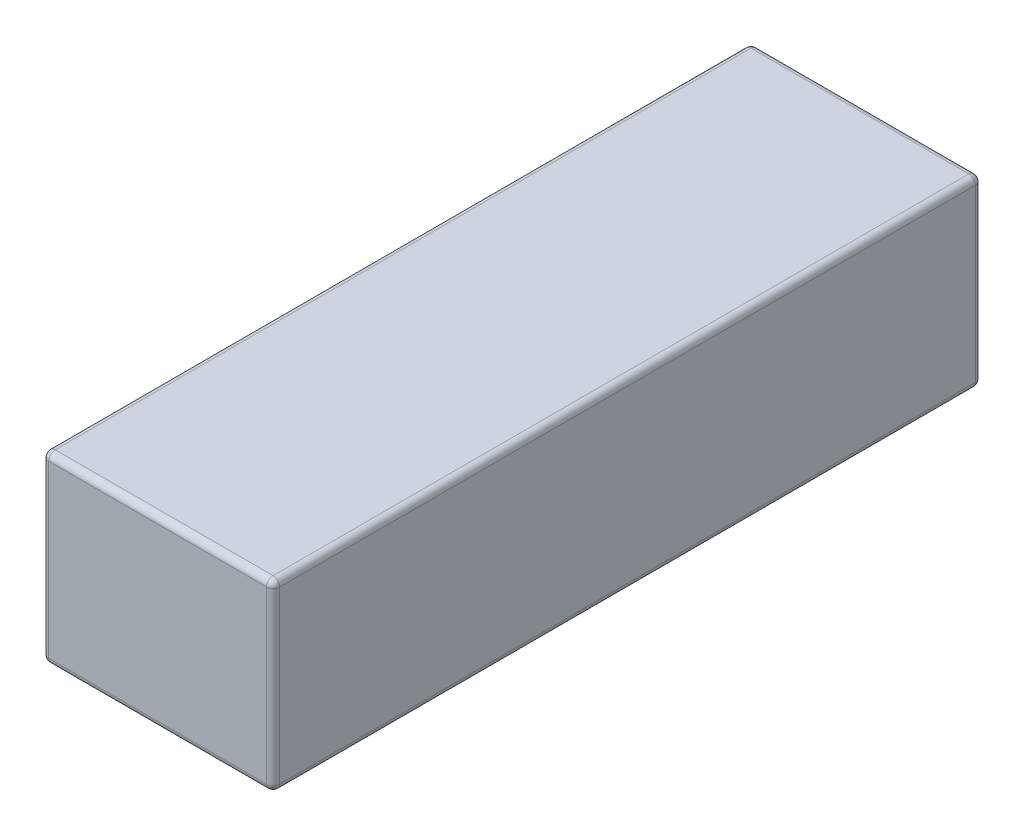
ISO-10303-21;
HEADER;
FILE_DESCRIPTION(('STEP AP214'),'2;1');
FILE_NAME('part.step','',(''),(''),'','','');
FILE_SCHEMA(('AUTOMOTIVE_DESIGN { 1 0 10303 214 1 1 1 1 }'));
ENDSEC;
DATA;
#1=APPLICATION_CONTEXT('core data for automotive mechanical design processes');
#2=APPLICATION_PROTOCOL_DEFINITION('international standard','automotive_design',2000,#1);
#3=PRODUCT_CONTEXT('',#1,'mechanical');
#4=PRODUCT('Part','Part','',(#3));
#5=PRODUCT_RELATED_PRODUCT_CATEGORY('part','',(#4));
#6=PRODUCT_DEFINITION_FORMATION('','',#4);
#7=PRODUCT_DEFINITION_CONTEXT('part definition',#1,'design');
#8=PRODUCT_DEFINITION('design','',#6,#7);
#9=PRODUCT_DEFINITION_SHAPE('','',#8);
#10=(LENGTH_UNIT() NAMED_UNIT(*) SI_UNIT(.MILLI.,.METRE.));
#11=(NAMED_UNIT(*) PLANE_ANGLE_UNIT() SI_UNIT($,.RADIAN.));
#12=(NAMED_UNIT(*) SI_UNIT($,.STERADIAN.) SOLID_ANGLE_UNIT());
#13=UNCERTAINTY_MEASURE_WITH_UNIT(LENGTH_MEASURE(1.E-05),#10,'distance_accuracy_value','');
#14=(GEOMETRIC_REPRESENTATION_CONTEXT(3) GLOBAL_UNCERTAINTY_ASSIGNED_CONTEXT((#13)) GLOBAL_UNIT_ASSIGNED_CONTEXT((#10,
#11,#12)) REPRESENTATION_CONTEXT('',''));
#15=CARTESIAN_POINT('',(0.,0.,0.));
#16=DIRECTION('',(0.,0.,1.));
#17=DIRECTION('',(1.,0.,0.));
#18=AXIS2_PLACEMENT_3D('',#15,#16,#17);
#19=CARTESIAN_POINT('',(44.,-17.5,-67.5));
#20=DIRECTION('',(0.,0.,1.));
#21=DIRECTION('',(1.,0.,0.));
#22=AXIS2_PLACEMENT_3D('',#19,#20,#21);
#23=PLANE('',#22);
#24=DIRECTION('',(0.,1.,0.));
#25=VECTOR('',#24,1.);
#26=CARTESIAN_POINT('',(42.75,-17.5,-67.5));
#27=LINE('',#26,#25);
#28=CARTESIAN_POINT('',(42.75,16.25,-67.5));
#29=VERTEX_POINT('',#28);
#30=CARTESIAN_POINT('',(42.75,-16.25,-67.5));
#31=VERTEX_POINT('',#30);
#32=EDGE_CURVE('E322',#29,#31,#27,.F.);
#33=ORIENTED_EDGE('',*,*,#32,.T.);
#34=DIRECTION('',(-1.,0.,0.));
#35=VECTOR('',#34,1.);
#36=CARTESIAN_POINT('',(44.,-16.25,-67.5));
#37=LINE('',#36,#35);
#38=CARTESIAN_POINT('',(1.25,-16.25,-67.5));
#39=VERTEX_POINT('',#38);
#40=EDGE_CURVE('E171',#31,#39,#37,.T.);
#41=ORIENTED_EDGE('',*,*,#40,.T.);
#42=DIRECTION('',(0.,1.,0.));
#43=VECTOR('',#42,1.);
#44=CARTESIAN_POINT('',(1.25,17.5,-67.5));
#45=LINE('',#44,#43);
#46=CARTESIAN_POINT('',(1.25,16.25,-67.5));
#47=VERTEX_POINT('',#46);
#48=EDGE_CURVE('E328',#39,#47,#45,.T.);
#49=ORIENTED_EDGE('',*,*,#48,.T.);
#50=DIRECTION('',(-1.,0.,0.));
#51=VECTOR('',#50,1.);
#52=CARTESIAN_POINT('',(44.,16.25,-67.5));
#53=LINE('',#52,#51);
#54=EDGE_CURVE('E318',#47,#29,#53,.F.);
#55=ORIENTED_EDGE('',*,*,#54,.T.);
#56=EDGE_LOOP('',(#33,#41,#49,#55));
#57=FACE_BOUND('',#56,.T.);
#58=ADVANCED_FACE('F42',(#57),#23,.F.);
#59=CARTESIAN_POINT('',(44.,17.5,67.5));
#60=DIRECTION('',(0.,-1.,0.));
#61=DIRECTION('',(0.,0.,-1.));
#62=AXIS2_PLACEMENT_3D('',#59,#60,#61);
#63=PLANE('',#62);
#64=DIRECTION('',(0.,0.,1.));
#65=VECTOR('',#64,1.);
#66=CARTESIAN_POINT('',(42.75,17.5,67.5));
#67=LINE('',#66,#65);
#68=CARTESIAN_POINT('',(42.75,17.5,66.25));
#69=VERTEX_POINT('',#68);
#70=CARTESIAN_POINT('',(42.75,17.5,-66.25));
#71=VERTEX_POINT('',#70);
#72=EDGE_CURVE('E268',#69,#71,#67,.F.);
#73=ORIENTED_EDGE('',*,*,#72,.T.);
#74=DIRECTION('',(-1.,0.,0.));
#75=VECTOR('',#74,1.);
#76=CARTESIAN_POINT('',(44.,17.5,-66.25));
#77=LINE('',#76,#75);
#78=CARTESIAN_POINT('',(1.25,17.5,-66.25));
#79=VERTEX_POINT('',#78);
#80=EDGE_CURVE('E11',#71,#79,#77,.T.);
#81=ORIENTED_EDGE('',*,*,#80,.T.);
#82=DIRECTION('',(0.,0.,1.));
#83=VECTOR('',#82,1.);
#84=CARTESIAN_POINT('',(1.25,17.5,67.5));
#85=LINE('',#84,#83);
#86=CARTESIAN_POINT('',(1.25,17.5,66.25));
#87=VERTEX_POINT('',#86);
#88=EDGE_CURVE('E52',#79,#87,#85,.T.);
#89=ORIENTED_EDGE('',*,*,#88,.T.);
#90=DIRECTION('',(-1.,0.,0.));
#91=VECTOR('',#90,1.);
#92=CARTESIAN_POINT('',(44.,17.5,66.25));
#93=LINE('',#92,#91);
#94=EDGE_CURVE('E245',#87,#69,#93,.F.);
#95=ORIENTED_EDGE('',*,*,#94,.T.);
#96=EDGE_LOOP('',(#73,#81,#89,#95));
#97=FACE_BOUND('',#96,.T.);
#98=ADVANCED_FACE('F351',(#97),#63,.F.);
#99=CARTESIAN_POINT('',(44.,-17.5,67.5));
#100=DIRECTION('',(0.,0.,-1.));
#101=DIRECTION('',(-1.,0.,0.));
#102=AXIS2_PLACEMENT_3D('',#99,#100,#101);
#103=PLANE('',#102);
#104=DIRECTION('',(0.,-1.,0.));
#105=VECTOR('',#104,1.);
#106=CARTESIAN_POINT('',(1.25,-17.5,67.5));
#107=LINE('',#106,#105);
#108=CARTESIAN_POINT('',(1.25,16.25,67.5));
#109=VERTEX_POINT('',#108);
#110=CARTESIAN_POINT('',(1.25,-16.25,67.5));
#111=VERTEX_POINT('',#110);
#112=EDGE_CURVE('E252',#109,#111,#107,.T.);
#113=ORIENTED_EDGE('',*,*,#112,.T.);
#114=DIRECTION('',(-1.,0.,0.));
#115=VECTOR('',#114,1.);
#116=CARTESIAN_POINT('',(44.,-16.25,67.5));
#117=LINE('',#116,#115);
#118=CARTESIAN_POINT('',(42.75,-16.25,67.5));
#119=VERTEX_POINT('',#118);
#120=EDGE_CURVE('E265',#111,#119,#117,.F.);
#121=ORIENTED_EDGE('',*,*,#120,.T.);
#122=DIRECTION('',(0.,-1.,0.));
#123=VECTOR('',#122,1.);
#124=CARTESIAN_POINT('',(42.75,-17.5,67.5));
#125=LINE('',#124,#123);
#126=CARTESIAN_POINT('',(42.75,16.25,67.5));
#127=VERTEX_POINT('',#126);
#128=EDGE_CURVE('E257',#119,#127,#125,.F.);
#129=ORIENTED_EDGE('',*,*,#128,.T.);
#130=DIRECTION('',(-1.,0.,0.));
#131=VECTOR('',#130,1.);
#132=CARTESIAN_POINT('',(44.,16.25,67.5));
#133=LINE('',#132,#131);
#134=EDGE_CURVE('E247',#127,#109,#133,.T.);
#135=ORIENTED_EDGE('',*,*,#134,.T.);
#136=EDGE_LOOP('',(#113,#121,#129,#135));
#137=FACE_BOUND('',#136,.T.);
#138=ADVANCED_FACE('F364',(#137),#103,.F.);
#139=CARTESIAN_POINT('',(44.,-17.5,67.5));
#140=DIRECTION('',(0.,1.,0.));
#141=DIRECTION('',(0.,0.,1.));
#142=AXIS2_PLACEMENT_3D('',#139,#140,#141);
#143=PLANE('',#142);
#144=DIRECTION('',(-1.,0.,0.));
#145=VECTOR('',#144,1.);
#146=CARTESIAN_POINT('',(44.,-17.5,66.25));
#147=LINE('',#146,#145);
#148=CARTESIAN_POINT('',(42.75,-17.5,66.25));
#149=VERTEX_POINT('',#148);
#150=CARTESIAN_POINT('',(1.25,-17.5,66.25));
#151=VERTEX_POINT('',#150);
#152=EDGE_CURVE('E146',#149,#151,#147,.T.);
#153=ORIENTED_EDGE('',*,*,#152,.T.);
#154=DIRECTION('',(0.,0.,-1.));
#155=VECTOR('',#154,1.);
#156=CARTESIAN_POINT('',(1.25,-17.5,-67.5));
#157=LINE('',#156,#155);
#158=CARTESIAN_POINT('',(1.25,-17.5,-66.25));
#159=VERTEX_POINT('',#158);
#160=EDGE_CURVE('E141',#151,#159,#157,.T.);
#161=ORIENTED_EDGE('',*,*,#160,.T.);
#162=DIRECTION('',(-1.,0.,0.));
#163=VECTOR('',#162,1.);
#164=CARTESIAN_POINT('',(44.,-17.5,-66.25));
#165=LINE('',#164,#163);
#166=CARTESIAN_POINT('',(42.75,-17.5,-66.25));
#167=VERTEX_POINT('',#166);
#168=EDGE_CURVE('E135',#159,#167,#165,.F.);
#169=ORIENTED_EDGE('',*,*,#168,.T.);
#170=DIRECTION('',(0.,0.,-1.));
#171=VECTOR('',#170,1.);
#172=CARTESIAN_POINT('',(42.75,-17.5,67.5));
#173=LINE('',#172,#171);
#174=EDGE_CURVE('E138',#167,#149,#173,.F.);
#175=ORIENTED_EDGE('',*,*,#174,.T.);
#176=EDGE_LOOP('',(#153,#161,#169,#175));
#177=FACE_BOUND('',#176,.T.);
#178=ADVANCED_FACE('F137',(#177),#143,.F.);
#179=CARTESIAN_POINT('',(44.,0.,0.));
#180=DIRECTION('',(-1.,0.,0.));
#181=DIRECTION('',(0.,0.,1.));
#182=AXIS2_PLACEMENT_3D('',#179,#180,#181);
#183=PLANE('',#182);
#184=DIRECTION('',(0.,-1.,0.));
#185=VECTOR('',#184,1.);
#186=CARTESIAN_POINT('',(44.,0.,66.25));
#187=LINE('',#186,#185);
#188=CARTESIAN_POINT('',(44.,16.25,66.25));
#189=VERTEX_POINT('',#188);
#190=CARTESIAN_POINT('',(44.,-16.25,66.25));
#191=VERTEX_POINT('',#190);
#192=EDGE_CURVE('E336',#189,#191,#187,.T.);
#193=ORIENTED_EDGE('',*,*,#192,.T.);
#194=DIRECTION('',(0.,0.,-1.));
#195=VECTOR('',#194,1.);
#196=CARTESIAN_POINT('',(44.,-16.25,0.));
#197=LINE('',#196,#195);
#198=CARTESIAN_POINT('',(44.,-16.25,-66.25));
#199=VERTEX_POINT('',#198);
#200=EDGE_CURVE('E253',#191,#199,#197,.T.);
#201=ORIENTED_EDGE('',*,*,#200,.T.);
#202=DIRECTION('',(0.,1.,0.));
#203=VECTOR('',#202,1.);
#204=CARTESIAN_POINT('',(44.,0.,-66.25));
#205=LINE('',#204,#203);
#206=CARTESIAN_POINT('',(44.,16.25,-66.25));
#207=VERTEX_POINT('',#206);
#208=EDGE_CURVE('E259',#199,#207,#205,.T.);
#209=ORIENTED_EDGE('',*,*,#208,.T.);
#210=DIRECTION('',(0.,0.,1.));
#211=VECTOR('',#210,1.);
#212=CARTESIAN_POINT('',(44.,16.25,0.));
#213=LINE('',#212,#211);
#214=EDGE_CURVE('E333',#207,#189,#213,.T.);
#215=ORIENTED_EDGE('',*,*,#214,.T.);
#216=EDGE_LOOP('',(#193,#201,#209,#215));
#217=FACE_BOUND('',#216,.T.);
#218=ADVANCED_FACE('F342',(#217),#183,.F.);
#219=CARTESIAN_POINT('',(0.,0.,0.));
#220=DIRECTION('',(-1.,0.,0.));
#221=DIRECTION('',(0.,0.,1.));
#222=AXIS2_PLACEMENT_3D('',#219,#220,#221);
#223=PLANE('',#222);
#224=DIRECTION('',(0.,1.,0.));
#225=VECTOR('',#224,1.);
#226=CARTESIAN_POINT('',(0.,-17.5,-66.25));
#227=LINE('',#226,#225);
#228=CARTESIAN_POINT('',(0.,16.25,-66.25));
#229=VERTEX_POINT('',#228);
#230=CARTESIAN_POINT('',(0.,-16.25,-66.25));
#231=VERTEX_POINT('',#230);
#232=EDGE_CURVE('E307',#229,#231,#227,.F.);
#233=ORIENTED_EDGE('',*,*,#232,.T.);
#234=DIRECTION('',(0.,0.,-1.));
#235=VECTOR('',#234,1.);
#236=CARTESIAN_POINT('',(0.,-16.25,67.5));
#237=LINE('',#236,#235);
#238=CARTESIAN_POINT('',(0.,-16.25,66.25));
#239=VERTEX_POINT('',#238);
#240=EDGE_CURVE('E311',#231,#239,#237,.F.);
#241=ORIENTED_EDGE('',*,*,#240,.T.);
#242=DIRECTION('',(0.,-1.,0.));
#243=VECTOR('',#242,1.);
#244=CARTESIAN_POINT('',(0.,17.5,66.25));
#245=LINE('',#244,#243);
#246=CARTESIAN_POINT('',(0.,16.25,66.25));
#247=VERTEX_POINT('',#246);
#248=EDGE_CURVE('E301',#239,#247,#245,.F.);
#249=ORIENTED_EDGE('',*,*,#248,.T.);
#250=DIRECTION('',(0.,0.,1.));
#251=VECTOR('',#250,1.);
#252=CARTESIAN_POINT('',(0.,16.25,-67.5));
#253=LINE('',#252,#251);
#254=EDGE_CURVE('E308',#247,#229,#253,.F.);
#255=ORIENTED_EDGE('',*,*,#254,.T.);
#256=EDGE_LOOP('',(#233,#241,#249,#255));
#257=FACE_BOUND('',#256,.T.);
#258=ADVANCED_FACE('F312',(#257),#223,.T.);
#259=CARTESIAN_POINT('',(42.75,16.25,0.));
#260=DIRECTION('',(0.,0.,1.));
#261=DIRECTION('',(1.,0.,0.));
#262=AXIS2_PLACEMENT_3D('',#259,#260,#261);
#263=CYLINDRICAL_SURFACE('',#262,1.25);
#264=CARTESIAN_POINT('',(42.75,16.25,66.25));
#265=DIRECTION('',(0.,0.,1.));
#266=DIRECTION('',(1.,0.,0.));
#267=AXIS2_PLACEMENT_3D('',#264,#265,#266);
#268=CIRCLE('',#267,1.25);
#269=EDGE_CURVE('E46',#189,#69,#268,.T.);
#270=ORIENTED_EDGE('',*,*,#269,.F.);
#271=ORIENTED_EDGE('',*,*,#214,.F.);
#272=CARTESIAN_POINT('',(42.75,16.25,-66.25));
#273=DIRECTION('',(0.,0.,-1.));
#274=DIRECTION('',(-1.,0.,0.));
#275=AXIS2_PLACEMENT_3D('',#272,#273,#274);
#276=CIRCLE('',#275,1.25);
#277=EDGE_CURVE('E224',#71,#207,#276,.T.);
#278=ORIENTED_EDGE('',*,*,#277,.F.);
#279=ORIENTED_EDGE('',*,*,#72,.F.);
#280=EDGE_LOOP('',(#270,#271,#278,#279));
#281=FACE_BOUND('',#280,.T.);
#282=ADVANCED_FACE('F44',(#281),#263,.T.);
#283=CARTESIAN_POINT('',(42.75,16.25,66.25));
#284=DIRECTION('',(0.,1.,0.));
#285=DIRECTION('',(0.,0.,1.));
#286=AXIS2_PLACEMENT_3D('',#283,#284,#285);
#287=SPHERICAL_SURFACE('',#286,1.25);
#288=CARTESIAN_POINT('',(42.75,16.25,66.25));
#289=DIRECTION('',(0.,1.,0.));
#290=DIRECTION('',(0.,0.,1.));
#291=AXIS2_PLACEMENT_3D('',#288,#289,#290);
#292=CIRCLE('',#291,1.25);
#293=EDGE_CURVE('E217',#189,#127,#292,.F.);
#294=ORIENTED_EDGE('',*,*,#293,.F.);
#295=ORIENTED_EDGE('',*,*,#269,.T.);
#296=CARTESIAN_POINT('',(42.75,16.25,66.25));
#297=DIRECTION('',(1.,0.,0.));
#298=DIRECTION('',(0.,0.,-1.));
#299=AXIS2_PLACEMENT_3D('',#296,#297,#298);
#300=CIRCLE('',#299,1.25);
#301=EDGE_CURVE('E221',#127,#69,#300,.F.);
#302=ORIENTED_EDGE('',*,*,#301,.F.);
#303=EDGE_LOOP('',(#294,#295,#302));
#304=FACE_BOUND('',#303,.T.);
#305=ADVANCED_FACE('F238',(#304),#287,.T.);
#306=CARTESIAN_POINT('',(42.75,16.25,-66.25));
#307=DIRECTION('',(1.,0.,0.));
#308=DIRECTION('',(0.,0.,-1.));
#309=AXIS2_PLACEMENT_3D('',#306,#307,#308);
#310=SPHERICAL_SURFACE('',#309,1.25);
#311=CARTESIAN_POINT('',(42.75,16.25,-66.25));
#312=DIRECTION('',(1.,0.,0.));
#313=DIRECTION('',(0.,0.,-1.));
#314=AXIS2_PLACEMENT_3D('',#311,#312,#313);
#315=CIRCLE('',#314,1.25);
#316=EDGE_CURVE('E210',#71,#29,#315,.F.);
#317=ORIENTED_EDGE('',*,*,#316,.F.);
#318=ORIENTED_EDGE('',*,*,#277,.T.);
#319=CARTESIAN_POINT('',(42.75,16.25,-66.25));
#320=DIRECTION('',(0.,1.,0.));
#321=DIRECTION('',(0.,0.,1.));
#322=AXIS2_PLACEMENT_3D('',#319,#320,#321);
#323=CIRCLE('',#322,1.25);
#324=EDGE_CURVE('E214',#29,#207,#323,.F.);
#325=ORIENTED_EDGE('',*,*,#324,.F.);
#326=EDGE_LOOP('',(#317,#318,#325));
#327=FACE_BOUND('',#326,.T.);
#328=ADVANCED_FACE('F346',(#327),#310,.T.);
#329=CARTESIAN_POINT('',(44.,16.25,66.25));
#330=DIRECTION('',(-1.,0.,0.));
#331=DIRECTION('',(0.,0.,1.));
#332=AXIS2_PLACEMENT_3D('',#329,#330,#331);
#333=CYLINDRICAL_SURFACE('',#332,1.25);
#334=ORIENTED_EDGE('',*,*,#301,.T.);
#335=ORIENTED_EDGE('',*,*,#94,.F.);
#336=CARTESIAN_POINT('',(1.25,16.25,66.25));
#337=DIRECTION('',(-1.,0.,0.));
#338=DIRECTION('',(0.,0.,1.));
#339=AXIS2_PLACEMENT_3D('',#336,#337,#338);
#340=CIRCLE('',#339,1.25);
#341=EDGE_CURVE('E202',#109,#87,#340,.T.);
#342=ORIENTED_EDGE('',*,*,#341,.F.);
#343=ORIENTED_EDGE('',*,*,#134,.F.);
#344=EDGE_LOOP('',(#334,#335,#342,#343));
#345=FACE_BOUND('',#344,.T.);
#346=ADVANCED_FACE('F243',(#345),#333,.T.);
#347=CARTESIAN_POINT('',(42.75,0.,66.25));
#348=DIRECTION('',(0.,-1.,0.));
#349=DIRECTION('',(0.,0.,-1.));
#350=AXIS2_PLACEMENT_3D('',#347,#348,#349);
#351=CYLINDRICAL_SURFACE('',#350,1.25);
#352=ORIENTED_EDGE('',*,*,#293,.T.);
#353=ORIENTED_EDGE('',*,*,#128,.F.);
#354=CARTESIAN_POINT('',(42.75,-16.25,66.25));
#355=DIRECTION('',(0.,-1.,0.));
#356=DIRECTION('',(0.,0.,-1.));
#357=AXIS2_PLACEMENT_3D('',#354,#355,#356);
#358=CIRCLE('',#357,1.25);
#359=EDGE_CURVE('E198',#191,#119,#358,.T.);
#360=ORIENTED_EDGE('',*,*,#359,.F.);
#361=ORIENTED_EDGE('',*,*,#192,.F.);
#362=EDGE_LOOP('',(#352,#353,#360,#361));
#363=FACE_BOUND('',#362,.T.);
#364=ADVANCED_FACE('F412',(#363),#351,.T.);
#365=CARTESIAN_POINT('',(42.75,-16.25,0.));
#366=DIRECTION('',(0.,0.,-1.));
#367=DIRECTION('',(-1.,0.,0.));
#368=AXIS2_PLACEMENT_3D('',#365,#366,#367);
#369=CYLINDRICAL_SURFACE('',#368,1.25);
#370=CARTESIAN_POINT('',(42.75,-16.25,-66.25));
#371=DIRECTION('',(0.,0.,-1.));
#372=DIRECTION('',(-1.,0.,0.));
#373=AXIS2_PLACEMENT_3D('',#370,#371,#372);
#374=CIRCLE('',#373,1.25);
#375=EDGE_CURVE('E153',#199,#167,#374,.T.);
#376=ORIENTED_EDGE('',*,*,#375,.F.);
#377=ORIENTED_EDGE('',*,*,#200,.F.);
#378=CARTESIAN_POINT('',(42.75,-16.25,66.25));
#379=DIRECTION('',(0.,0.,1.));
#380=DIRECTION('',(1.,0.,0.));
#381=AXIS2_PLACEMENT_3D('',#378,#379,#380);
#382=CIRCLE('',#381,1.25);
#383=EDGE_CURVE('E156',#149,#191,#382,.T.);
#384=ORIENTED_EDGE('',*,*,#383,.F.);
#385=ORIENTED_EDGE('',*,*,#174,.F.);
#386=EDGE_LOOP('',(#376,#377,#384,#385));
#387=FACE_BOUND('',#386,.T.);
#388=ADVANCED_FACE('F151',(#387),#369,.T.);
#389=CARTESIAN_POINT('',(42.75,0.,-66.25));
#390=DIRECTION('',(0.,1.,0.));
#391=DIRECTION('',(0.,0.,1.));
#392=AXIS2_PLACEMENT_3D('',#389,#390,#391);
#393=CYLINDRICAL_SURFACE('',#392,1.25);
#394=ORIENTED_EDGE('',*,*,#324,.T.);
#395=ORIENTED_EDGE('',*,*,#208,.F.);
#396=CARTESIAN_POINT('',(42.75,-16.25,-66.25));
#397=DIRECTION('',(0.,-1.,0.));
#398=DIRECTION('',(0.,0.,-1.));
#399=AXIS2_PLACEMENT_3D('',#396,#397,#398);
#400=CIRCLE('',#399,1.25);
#401=EDGE_CURVE('E166',#31,#199,#400,.T.);
#402=ORIENTED_EDGE('',*,*,#401,.F.);
#403=ORIENTED_EDGE('',*,*,#32,.F.);
#404=EDGE_LOOP('',(#394,#395,#402,#403));
#405=FACE_BOUND('',#404,.T.);
#406=ADVANCED_FACE('F344',(#405),#393,.T.);
#407=CARTESIAN_POINT('',(44.,16.25,-66.25));
#408=DIRECTION('',(-1.,0.,0.));
#409=DIRECTION('',(0.,0.,1.));
#410=AXIS2_PLACEMENT_3D('',#407,#408,#409);
#411=CYLINDRICAL_SURFACE('',#410,1.25);
#412=ORIENTED_EDGE('',*,*,#316,.T.);
#413=ORIENTED_EDGE('',*,*,#54,.F.);
#414=CARTESIAN_POINT('',(1.25,16.25,-66.25));
#415=DIRECTION('',(-1.,0.,0.));
#416=DIRECTION('',(0.,0.,1.));
#417=AXIS2_PLACEMENT_3D('',#414,#415,#416);
#418=CIRCLE('',#417,1.25);
#419=EDGE_CURVE('E191',#79,#47,#418,.T.);
#420=ORIENTED_EDGE('',*,*,#419,.F.);
#421=ORIENTED_EDGE('',*,*,#80,.F.);
#422=EDGE_LOOP('',(#412,#413,#420,#421));
#423=FACE_BOUND('',#422,.T.);
#424=ADVANCED_FACE('F350',(#423),#411,.T.);
#425=CARTESIAN_POINT('',(1.25,16.25,67.5));
#426=DIRECTION('',(0.,0.,-1.));
#427=DIRECTION('',(-1.,0.,0.));
#428=AXIS2_PLACEMENT_3D('',#425,#426,#427);
#429=CYLINDRICAL_SURFACE('',#428,1.25);
#430=CARTESIAN_POINT('',(1.25,16.25,66.25));
#431=DIRECTION('',(0.,0.,1.));
#432=DIRECTION('',(1.,0.,0.));
#433=AXIS2_PLACEMENT_3D('',#430,#431,#432);
#434=CIRCLE('',#433,1.25);
#435=EDGE_CURVE('E206',#87,#247,#434,.T.);
#436=ORIENTED_EDGE('',*,*,#435,.F.);
#437=ORIENTED_EDGE('',*,*,#88,.F.);
#438=CARTESIAN_POINT('',(1.25,16.25,-66.25));
#439=DIRECTION('',(0.,0.,-1.));
#440=DIRECTION('',(-1.,0.,0.));
#441=AXIS2_PLACEMENT_3D('',#438,#439,#440);
#442=CIRCLE('',#441,1.25);
#443=EDGE_CURVE('E60',#229,#79,#442,.T.);
#444=ORIENTED_EDGE('',*,*,#443,.F.);
#445=ORIENTED_EDGE('',*,*,#254,.F.);
#446=EDGE_LOOP('',(#436,#437,#444,#445));
#447=FACE_BOUND('',#446,.T.);
#448=ADVANCED_FACE('F401',(#447),#429,.T.);
#449=CARTESIAN_POINT('',(1.25,16.25,66.25));
#450=DIRECTION('',(0.,1.,0.));
#451=DIRECTION('',(-1.,0.,0.));
#452=AXIS2_PLACEMENT_3D('',#449,#450,#451);
#453=SPHERICAL_SURFACE('',#452,1.25);
#454=ORIENTED_EDGE('',*,*,#341,.T.);
#455=ORIENTED_EDGE('',*,*,#435,.T.);
#456=CARTESIAN_POINT('',(1.25,16.25,66.25));
#457=DIRECTION('',(0.,1.,0.));
#458=DIRECTION('',(0.,0.,1.));
#459=AXIS2_PLACEMENT_3D('',#456,#457,#458);
#460=CIRCLE('',#459,1.25);
#461=EDGE_CURVE('E179',#109,#247,#460,.F.);
#462=ORIENTED_EDGE('',*,*,#461,.F.);
#463=EDGE_LOOP('',(#454,#455,#462));
#464=FACE_BOUND('',#463,.T.);
#465=ADVANCED_FACE('F397',(#464),#453,.T.);
#466=CARTESIAN_POINT('',(42.75,-16.25,66.25));
#467=DIRECTION('',(1.,0.,0.));
#468=DIRECTION('',(0.,0.,-1.));
#469=AXIS2_PLACEMENT_3D('',#466,#467,#468);
#470=SPHERICAL_SURFACE('',#469,1.25);
#471=ORIENTED_EDGE('',*,*,#383,.T.);
#472=ORIENTED_EDGE('',*,*,#359,.T.);
#473=CARTESIAN_POINT('',(42.75,-16.25,66.25));
#474=DIRECTION('',(1.,0.,0.));
#475=DIRECTION('',(0.,0.,-1.));
#476=AXIS2_PLACEMENT_3D('',#473,#474,#475);
#477=CIRCLE('',#476,1.25);
#478=EDGE_CURVE('E173',#149,#119,#477,.F.);
#479=ORIENTED_EDGE('',*,*,#478,.F.);
#480=EDGE_LOOP('',(#471,#472,#479));
#481=FACE_BOUND('',#480,.T.);
#482=ADVANCED_FACE('F394',(#481),#470,.T.);
#483=CARTESIAN_POINT('',(42.75,-16.25,-66.25));
#484=DIRECTION('',(1.,0.,0.));
#485=DIRECTION('',(0.,0.,-1.));
#486=AXIS2_PLACEMENT_3D('',#483,#484,#485);
#487=SPHERICAL_SURFACE('',#486,1.25);
#488=ORIENTED_EDGE('',*,*,#401,.T.);
#489=ORIENTED_EDGE('',*,*,#375,.T.);
#490=CARTESIAN_POINT('',(42.75,-16.25,-66.25));
#491=DIRECTION('',(1.,0.,0.));
#492=DIRECTION('',(0.,0.,-1.));
#493=AXIS2_PLACEMENT_3D('',#490,#491,#492);
#494=CIRCLE('',#493,1.25);
#495=EDGE_CURVE('E163',#31,#167,#494,.F.);
#496=ORIENTED_EDGE('',*,*,#495,.F.);
#497=EDGE_LOOP('',(#488,#489,#496));
#498=FACE_BOUND('',#497,.T.);
#499=ADVANCED_FACE('F162',(#498),#487,.T.);
#500=CARTESIAN_POINT('',(1.25,16.25,-66.25));
#501=DIRECTION('',(0.,1.,0.));
#502=DIRECTION('',(-1.,0.,0.));
#503=AXIS2_PLACEMENT_3D('',#500,#501,#502);
#504=SPHERICAL_SURFACE('',#503,1.25);
#505=ORIENTED_EDGE('',*,*,#443,.T.);
#506=ORIENTED_EDGE('',*,*,#419,.T.);
#507=CARTESIAN_POINT('',(1.25,16.25,-66.25));
#508=DIRECTION('',(0.,1.,0.));
#509=DIRECTION('',(0.,0.,1.));
#510=AXIS2_PLACEMENT_3D('',#507,#508,#509);
#511=CIRCLE('',#510,1.25);
#512=EDGE_CURVE('E174',#229,#47,#511,.F.);
#513=ORIENTED_EDGE('',*,*,#512,.F.);
#514=EDGE_LOOP('',(#505,#506,#513));
#515=FACE_BOUND('',#514,.T.);
#516=ADVANCED_FACE('F389',(#515),#504,.T.);
#517=CARTESIAN_POINT('',(1.25,-17.5,66.25));
#518=DIRECTION('',(0.,1.,0.));
#519=DIRECTION('',(0.,0.,1.));
#520=AXIS2_PLACEMENT_3D('',#517,#518,#519);
#521=CYLINDRICAL_SURFACE('',#520,1.25);
#522=ORIENTED_EDGE('',*,*,#461,.T.);
#523=ORIENTED_EDGE('',*,*,#248,.F.);
#524=CARTESIAN_POINT('',(1.25,-16.25,66.25));
#525=DIRECTION('',(0.,-1.,0.));
#526=DIRECTION('',(0.,0.,-1.));
#527=AXIS2_PLACEMENT_3D('',#524,#525,#526);
#528=CIRCLE('',#527,1.25);
#529=EDGE_CURVE('E182',#111,#239,#528,.T.);
#530=ORIENTED_EDGE('',*,*,#529,.F.);
#531=ORIENTED_EDGE('',*,*,#112,.F.);
#532=EDGE_LOOP('',(#522,#523,#530,#531));
#533=FACE_BOUND('',#532,.T.);
#534=ADVANCED_FACE('F303',(#533),#521,.T.);
#535=CARTESIAN_POINT('',(44.,-16.25,66.25));
#536=DIRECTION('',(-1.,0.,0.));
#537=DIRECTION('',(0.,0.,1.));
#538=AXIS2_PLACEMENT_3D('',#535,#536,#537);
#539=CYLINDRICAL_SURFACE('',#538,1.25);
#540=ORIENTED_EDGE('',*,*,#478,.T.);
#541=ORIENTED_EDGE('',*,*,#120,.F.);
#542=CARTESIAN_POINT('',(1.25,-16.25,66.25));
#543=DIRECTION('',(-1.,0.,0.));
#544=DIRECTION('',(0.,0.,1.));
#545=AXIS2_PLACEMENT_3D('',#542,#543,#544);
#546=CIRCLE('',#545,1.25);
#547=EDGE_CURVE('E288',#151,#111,#546,.T.);
#548=ORIENTED_EDGE('',*,*,#547,.F.);
#549=ORIENTED_EDGE('',*,*,#152,.F.);
#550=EDGE_LOOP('',(#540,#541,#548,#549));
#551=FACE_BOUND('',#550,.T.);
#552=ADVANCED_FACE('F383',(#551),#539,.T.);
#553=CARTESIAN_POINT('',(44.,-16.25,-66.25));
#554=DIRECTION('',(-1.,0.,0.));
#555=DIRECTION('',(0.,0.,1.));
#556=AXIS2_PLACEMENT_3D('',#553,#554,#555);
#557=CYLINDRICAL_SURFACE('',#556,1.25);
#558=ORIENTED_EDGE('',*,*,#495,.T.);
#559=ORIENTED_EDGE('',*,*,#168,.F.);
#560=CARTESIAN_POINT('',(1.25,-16.25,-66.25));
#561=DIRECTION('',(-1.,0.,0.));
#562=DIRECTION('',(0.,0.,1.));
#563=AXIS2_PLACEMENT_3D('',#560,#561,#562);
#564=CIRCLE('',#563,1.25);
#565=EDGE_CURVE('E284',#39,#159,#564,.T.);
#566=ORIENTED_EDGE('',*,*,#565,.F.);
#567=ORIENTED_EDGE('',*,*,#40,.F.);
#568=EDGE_LOOP('',(#558,#559,#566,#567));
#569=FACE_BOUND('',#568,.T.);
#570=ADVANCED_FACE('F169',(#569),#557,.T.);
#571=CARTESIAN_POINT('',(1.25,-17.5,-66.25));
#572=DIRECTION('',(0.,-1.,0.));
#573=DIRECTION('',(0.,0.,-1.));
#574=AXIS2_PLACEMENT_3D('',#571,#572,#573);
#575=CYLINDRICAL_SURFACE('',#574,1.25);
#576=ORIENTED_EDGE('',*,*,#512,.T.);
#577=ORIENTED_EDGE('',*,*,#48,.F.);
#578=CARTESIAN_POINT('',(1.25,-16.25,-66.25));
#579=DIRECTION('',(0.,-1.,0.));
#580=DIRECTION('',(0.,0.,-1.));
#581=AXIS2_PLACEMENT_3D('',#578,#579,#580);
#582=CIRCLE('',#581,1.25);
#583=EDGE_CURVE('E281',#231,#39,#582,.T.);
#584=ORIENTED_EDGE('',*,*,#583,.F.);
#585=ORIENTED_EDGE('',*,*,#232,.F.);
#586=EDGE_LOOP('',(#576,#577,#584,#585));
#587=FACE_BOUND('',#586,.T.);
#588=ADVANCED_FACE('F377',(#587),#575,.T.);
#589=CARTESIAN_POINT('',(1.25,-16.25,66.25));
#590=DIRECTION('',(0.,0.,1.));
#591=DIRECTION('',(1.,0.,0.));
#592=AXIS2_PLACEMENT_3D('',#589,#590,#591);
#593=SPHERICAL_SURFACE('',#592,1.25);
#594=ORIENTED_EDGE('',*,*,#547,.T.);
#595=ORIENTED_EDGE('',*,*,#529,.T.);
#596=CARTESIAN_POINT('',(1.25,-16.25,66.25));
#597=DIRECTION('',(0.,0.,1.));
#598=DIRECTION('',(1.,0.,0.));
#599=AXIS2_PLACEMENT_3D('',#596,#597,#598);
#600=CIRCLE('',#599,1.25);
#601=EDGE_CURVE('E278',#151,#239,#600,.F.);
#602=ORIENTED_EDGE('',*,*,#601,.F.);
#603=EDGE_LOOP('',(#594,#595,#602));
#604=FACE_BOUND('',#603,.T.);
#605=ADVANCED_FACE('F297',(#604),#593,.T.);
#606=CARTESIAN_POINT('',(1.25,-16.25,-66.25));
#607=DIRECTION('',(0.,0.,-1.));
#608=DIRECTION('',(-1.,0.,0.));
#609=AXIS2_PLACEMENT_3D('',#606,#607,#608);
#610=SPHERICAL_SURFACE('',#609,1.25);
#611=ORIENTED_EDGE('',*,*,#583,.T.);
#612=ORIENTED_EDGE('',*,*,#565,.T.);
#613=CARTESIAN_POINT('',(1.25,-16.25,-66.25));
#614=DIRECTION('',(0.,0.,-1.));
#615=DIRECTION('',(-1.,0.,0.));
#616=AXIS2_PLACEMENT_3D('',#613,#614,#615);
#617=CIRCLE('',#616,1.25);
#618=EDGE_CURVE('E275',#231,#159,#617,.F.);
#619=ORIENTED_EDGE('',*,*,#618,.F.);
#620=EDGE_LOOP('',(#611,#612,#619));
#621=FACE_BOUND('',#620,.T.);
#622=ADVANCED_FACE('F371',(#621),#610,.T.);
#623=CARTESIAN_POINT('',(1.25,-16.25,67.5));
#624=DIRECTION('',(0.,0.,1.));
#625=DIRECTION('',(1.,0.,0.));
#626=AXIS2_PLACEMENT_3D('',#623,#624,#625);
#627=CYLINDRICAL_SURFACE('',#626,1.25);
#628=ORIENTED_EDGE('',*,*,#601,.T.);
#629=ORIENTED_EDGE('',*,*,#240,.F.);
#630=ORIENTED_EDGE('',*,*,#618,.T.);
#631=ORIENTED_EDGE('',*,*,#160,.F.);
#632=EDGE_LOOP('',(#628,#629,#630,#631));
#633=FACE_BOUND('',#632,.T.);
#634=ADVANCED_FACE('F368',(#633),#627,.T.);
#635=CLOSED_SHELL('',(#58,#98,#138,#178,#218,#258,#282,#305,#328,#346,#364,#388,#406,#424,#448,
#465,#482,#499,#516,#534,#552,#570,#588,#605,#622,#634));
#636=MANIFOLD_SOLID_BREP('B2',#635);
#637=ADVANCED_BREP_SHAPE_REPRESENTATION('',(#18,#636),#14);
#638=SHAPE_DEFINITION_REPRESENTATION(#9,#637);
ENDSEC;
END-ISO-10303-21;
